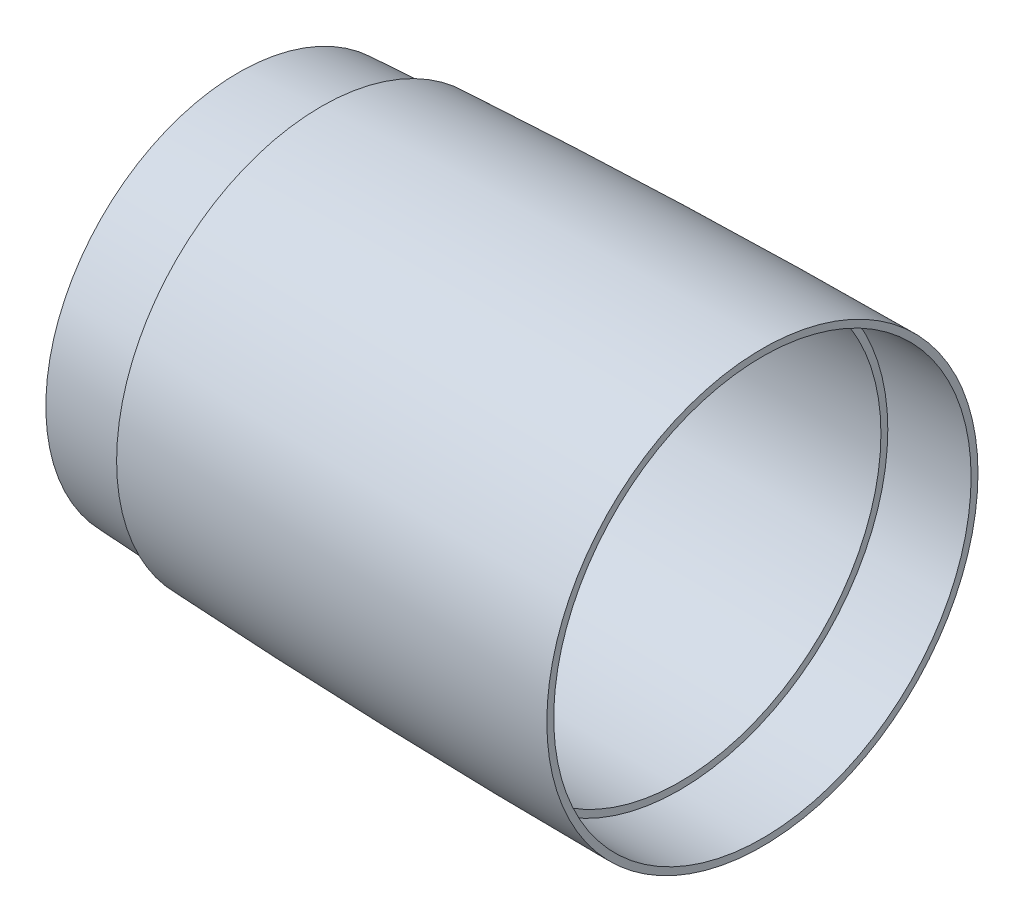
ISO-10303-21;
HEADER;
FILE_DESCRIPTION(('STEP AP214'),'2;1');
FILE_NAME('part.step','',(''),(''),'','','');
FILE_SCHEMA(('AUTOMOTIVE_DESIGN { 1 0 10303 214 1 1 1 1 }'));
ENDSEC;
DATA;
#1=APPLICATION_CONTEXT('core data for automotive mechanical design processes');
#2=APPLICATION_PROTOCOL_DEFINITION('international standard','automotive_design',2000,#1);
#3=PRODUCT_CONTEXT('',#1,'mechanical');
#4=PRODUCT('Part','Part','',(#3));
#5=PRODUCT_RELATED_PRODUCT_CATEGORY('part','',(#4));
#6=PRODUCT_DEFINITION_FORMATION('','',#4);
#7=PRODUCT_DEFINITION_CONTEXT('part definition',#1,'design');
#8=PRODUCT_DEFINITION('design','',#6,#7);
#9=PRODUCT_DEFINITION_SHAPE('','',#8);
#10=(LENGTH_UNIT() NAMED_UNIT(*) SI_UNIT(.MILLI.,.METRE.));
#11=(NAMED_UNIT(*) PLANE_ANGLE_UNIT() SI_UNIT($,.RADIAN.));
#12=(NAMED_UNIT(*) SI_UNIT($,.STERADIAN.) SOLID_ANGLE_UNIT());
#13=UNCERTAINTY_MEASURE_WITH_UNIT(LENGTH_MEASURE(1.E-05),#10,'distance_accuracy_value','');
#14=(GEOMETRIC_REPRESENTATION_CONTEXT(3) GLOBAL_UNCERTAINTY_ASSIGNED_CONTEXT((#13)) GLOBAL_UNIT_ASSIGNED_CONTEXT((#10,
#11,#12)) REPRESENTATION_CONTEXT('',''));
#15=CARTESIAN_POINT('',(0.,0.,0.));
#16=DIRECTION('',(0.,0.,1.));
#17=DIRECTION('',(1.,0.,0.));
#18=AXIS2_PLACEMENT_3D('',#15,#16,#17);
#19=CARTESIAN_POINT('',(0.,3557.29676158737,0.));
#20=DIRECTION('',(1.,0.,0.));
#21=DIRECTION('',(0.,0.,-1.));
#22=AXIS2_PLACEMENT_3D('',#19,#20,#21);
#23=DEGENERATE_TOROIDAL_SURFACE('',#22,3557.29676158737,3632.7,.F.);
#24=CARTESIAN_POINT('',(-169.99999999966,3557.29676158737,0.));
#25=DIRECTION('',(1.,0.,0.));
#26=DIRECTION('',(0.,0.,-1.));
#27=AXIS2_PLACEMENT_3D('',#24,#25,#26);
#28=CIRCLE('',#27,71.4233006384415);
#29=CARTESIAN_POINT('',(-169.99999999966,3557.29676158737,-71.4233006384415));
#30=VERTEX_POINT('',#29);
#31=EDGE_CURVE('E67',#30,#30,#28,.T.);
#32=ORIENTED_EDGE('',*,*,#31,.F.);
#33=EDGE_LOOP('',(#32));
#34=FACE_BOUND('',#33,.T.);
#35=CARTESIAN_POINT('',(-199.99999999966,3557.29676158737,0.));
#36=DIRECTION('',(1.,0.,0.));
#37=DIRECTION('',(0.,0.,-1.));
#38=AXIS2_PLACEMENT_3D('',#35,#36,#37);
#39=CIRCLE('',#38,69.8935132672753);
#40=CARTESIAN_POINT('',(-199.99999999966,3557.29676158737,-69.8935132672753));
#41=VERTEX_POINT('',#40);
#42=EDGE_CURVE('E10',#41,#41,#39,.T.);
#43=ORIENTED_EDGE('',*,*,#42,.T.);
#44=EDGE_LOOP('',(#43));
#45=FACE_BOUND('',#44,.T.);
#46=ADVANCED_FACE('F39',(#34,#45),#23,.F.);
#47=CARTESIAN_POINT('',(-199.99999999966,0.,0.));
#48=DIRECTION('',(-1.,0.,0.));
#49=DIRECTION('',(0.,0.,1.));
#50=AXIS2_PLACEMENT_3D('',#47,#48,#49);
#51=PLANE('',#50);
#52=CARTESIAN_POINT('',(-199.99999999966,3557.29676158737,0.));
#53=DIRECTION('',(1.,0.,0.));
#54=DIRECTION('',(0.,0.,-1.));
#55=AXIS2_PLACEMENT_3D('',#52,#53,#54);
#56=CIRCLE('',#55,67.6901694235714);
#57=CARTESIAN_POINT('',(-199.99999999966,3557.29676158737,-67.6901694235714));
#58=VERTEX_POINT('',#57);
#59=EDGE_CURVE('E45',#58,#58,#56,.T.);
#60=ORIENTED_EDGE('',*,*,#59,.T.);
#61=EDGE_LOOP('',(#60));
#62=FACE_BOUND('',#61,.T.);
#63=ORIENTED_EDGE('',*,*,#42,.F.);
#64=EDGE_LOOP('',(#63));
#65=FACE_BOUND('',#64,.T.);
#66=ADVANCED_FACE('F74',(#62,#65),#51,.T.);
#67=CARTESIAN_POINT('',(0.,3557.29676158737,0.));
#68=DIRECTION('',(1.,0.,0.));
#69=DIRECTION('',(0.,0.,-1.));
#70=AXIS2_PLACEMENT_3D('',#67,#68,#69);
#71=DEGENERATE_TOROIDAL_SURFACE('',#70,3557.29676158737,3630.5,.F.);
#72=ORIENTED_EDGE('',*,*,#59,.F.);
#73=EDGE_LOOP('',(#72));
#74=FACE_BOUND('',#73,.T.);
#75=CARTESIAN_POINT('',(-40.,3557.29676158737,0.));
#76=DIRECTION('',(1.,0.,0.));
#77=DIRECTION('',(0.,0.,-1.));
#78=AXIS2_PLACEMENT_3D('',#75,#76,#77);
#79=CIRCLE('',#78,72.9828764019662);
#80=CARTESIAN_POINT('',(-40.,3557.29676158737,-72.9828764019662));
#81=VERTEX_POINT('',#80);
#82=EDGE_CURVE('E49',#81,#81,#79,.T.);
#83=ORIENTED_EDGE('',*,*,#82,.T.);
#84=EDGE_LOOP('',(#83));
#85=FACE_BOUND('',#84,.T.);
#86=ADVANCED_FACE('F78',(#74,#85),#71,.T.);
#87=CARTESIAN_POINT('',(-40.,0.,0.));
#88=DIRECTION('',(-1.,0.,0.));
#89=DIRECTION('',(0.,0.,1.));
#90=AXIS2_PLACEMENT_3D('',#87,#88,#89);
#91=PLANE('',#90);
#92=ORIENTED_EDGE('',*,*,#82,.F.);
#93=EDGE_LOOP('',(#92));
#94=FACE_BOUND('',#93,.T.);
#95=CARTESIAN_POINT('',(-40.,3557.29676158737,0.));
#96=DIRECTION('',(1.,0.,0.));
#97=DIRECTION('',(0.,0.,-1.));
#98=AXIS2_PLACEMENT_3D('',#95,#96,#97);
#99=CIRCLE('',#98,75.4830280503103);
#100=CARTESIAN_POINT('',(-40.,3557.29676158737,-75.4830280503103));
#101=VERTEX_POINT('',#100);
#102=EDGE_CURVE('E53',#101,#101,#99,.T.);
#103=ORIENTED_EDGE('',*,*,#102,.T.);
#104=EDGE_LOOP('',(#103));
#105=FACE_BOUND('',#104,.T.);
#106=ADVANCED_FACE('F82',(#94,#105),#91,.F.);
#107=CARTESIAN_POINT('',(0.,3557.29676158737,0.));
#108=DIRECTION('',(1.,0.,0.));
#109=DIRECTION('',(0.,0.,-1.));
#110=AXIS2_PLACEMENT_3D('',#107,#108,#109);
#111=DEGENERATE_TOROIDAL_SURFACE('',#110,3557.29676158737,3633.,.F.);
#112=ORIENTED_EDGE('',*,*,#102,.F.);
#113=EDGE_LOOP('',(#112));
#114=FACE_BOUND('',#113,.T.);
#115=CARTESIAN_POINT('',(-10.,3557.29676158737,0.));
#116=DIRECTION('',(1.,0.,0.));
#117=DIRECTION('',(0.,0.,-1.));
#118=AXIS2_PLACEMENT_3D('',#115,#116,#117);
#119=CIRCLE('',#118,75.6894756560342);
#120=CARTESIAN_POINT('',(-10.,3557.29676158737,-75.6894756560342));
#121=VERTEX_POINT('',#120);
#122=EDGE_CURVE('E58',#121,#121,#119,.T.);
#123=ORIENTED_EDGE('',*,*,#122,.T.);
#124=EDGE_LOOP('',(#123));
#125=FACE_BOUND('',#124,.T.);
#126=ADVANCED_FACE('F89',(#114,#125),#111,.T.);
#127=CARTESIAN_POINT('',(-10.,0.,0.));
#128=DIRECTION('',(1.,0.,0.));
#129=DIRECTION('',(0.,0.,-1.));
#130=AXIS2_PLACEMENT_3D('',#127,#128,#129);
#131=PLANE('',#130);
#132=CARTESIAN_POINT('',(-10.,3557.29676158737,0.));
#133=DIRECTION('',(1.,0.,0.));
#134=DIRECTION('',(0.,0.,-1.));
#135=AXIS2_PLACEMENT_3D('',#132,#133,#134);
#136=CIRCLE('',#135,78.1894851202125);
#137=CARTESIAN_POINT('',(-10.,3557.29676158737,-78.1894851202125));
#138=VERTEX_POINT('',#137);
#139=EDGE_CURVE('E61',#138,#138,#136,.T.);
#140=ORIENTED_EDGE('',*,*,#139,.T.);
#141=EDGE_LOOP('',(#140));
#142=FACE_BOUND('',#141,.T.);
#143=ORIENTED_EDGE('',*,*,#122,.F.);
#144=EDGE_LOOP('',(#143));
#145=FACE_BOUND('',#144,.T.);
#146=ADVANCED_FACE('F93',(#142,#145),#131,.T.);
#147=CARTESIAN_POINT('',(0.,3557.29676158737,0.));
#148=DIRECTION('',(1.,0.,0.));
#149=DIRECTION('',(0.,0.,-1.));
#150=AXIS2_PLACEMENT_3D('',#147,#148,#149);
#151=DEGENERATE_TOROIDAL_SURFACE('',#150,3557.29676158737,3635.5,.F.);
#152=CARTESIAN_POINT('',(-169.99999999966,3557.29676158737,0.));
#153=DIRECTION('',(1.,0.,0.));
#154=DIRECTION('',(0.,0.,-1.));
#155=AXIS2_PLACEMENT_3D('',#152,#153,#154);
#156=CIRCLE('',#155,74.226369276607);
#157=CARTESIAN_POINT('',(-169.99999999966,3557.29676158737,-74.226369276607));
#158=VERTEX_POINT('',#157);
#159=EDGE_CURVE('E64',#158,#158,#156,.T.);
#160=ORIENTED_EDGE('',*,*,#159,.T.);
#161=EDGE_LOOP('',(#160));
#162=FACE_BOUND('',#161,.T.);
#163=ORIENTED_EDGE('',*,*,#139,.F.);
#164=EDGE_LOOP('',(#163));
#165=FACE_BOUND('',#164,.T.);
#166=ADVANCED_FACE('F97',(#162,#165),#151,.F.);
#167=CARTESIAN_POINT('',(-169.99999999966,0.,0.));
#168=DIRECTION('',(1.,0.,0.));
#169=DIRECTION('',(0.,0.,-1.));
#170=AXIS2_PLACEMENT_3D('',#167,#168,#169);
#171=PLANE('',#170);
#172=ORIENTED_EDGE('',*,*,#159,.F.);
#173=EDGE_LOOP('',(#172));
#174=FACE_BOUND('',#173,.T.);
#175=ORIENTED_EDGE('',*,*,#31,.T.);
#176=EDGE_LOOP('',(#175));
#177=FACE_BOUND('',#176,.T.);
#178=ADVANCED_FACE('F71',(#174,#177),#171,.F.);
#179=CLOSED_SHELL('',(#46,#66,#86,#106,#126,#146,#166,#178));
#180=MANIFOLD_SOLID_BREP('B2',#179);
#181=ADVANCED_BREP_SHAPE_REPRESENTATION('',(#18,#180),#14);
#182=SHAPE_DEFINITION_REPRESENTATION(#9,#181);
ENDSEC;
END-ISO-10303-21;
